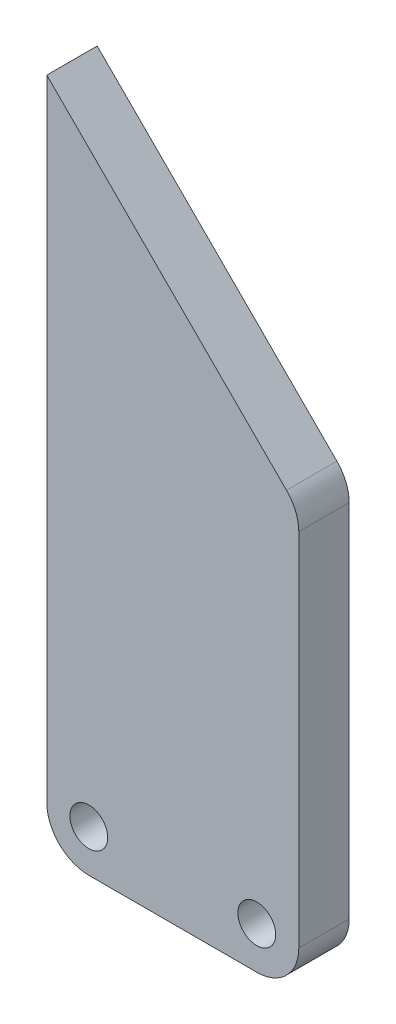
ISO-10303-21;
HEADER;
FILE_DESCRIPTION(('STEP AP214'),'2;1');
FILE_NAME('part.step','',(''),(''),'','','');
FILE_SCHEMA(('AUTOMOTIVE_DESIGN { 1 0 10303 214 1 1 1 1 }'));
ENDSEC;
DATA;
#1=APPLICATION_CONTEXT('core data for automotive mechanical design processes');
#2=APPLICATION_PROTOCOL_DEFINITION('international standard','automotive_design',2000,#1);
#3=PRODUCT_CONTEXT('',#1,'mechanical');
#4=PRODUCT('Part','Part','',(#3));
#5=PRODUCT_RELATED_PRODUCT_CATEGORY('part','',(#4));
#6=PRODUCT_DEFINITION_FORMATION('','',#4);
#7=PRODUCT_DEFINITION_CONTEXT('part definition',#1,'design');
#8=PRODUCT_DEFINITION('design','',#6,#7);
#9=PRODUCT_DEFINITION_SHAPE('','',#8);
#10=(LENGTH_UNIT() NAMED_UNIT(*) SI_UNIT(.MILLI.,.METRE.));
#11=(NAMED_UNIT(*) PLANE_ANGLE_UNIT() SI_UNIT($,.RADIAN.));
#12=(NAMED_UNIT(*) SI_UNIT($,.STERADIAN.) SOLID_ANGLE_UNIT());
#13=UNCERTAINTY_MEASURE_WITH_UNIT(LENGTH_MEASURE(1.E-05),#10,'distance_accuracy_value','');
#14=(GEOMETRIC_REPRESENTATION_CONTEXT(3) GLOBAL_UNCERTAINTY_ASSIGNED_CONTEXT((#13)) GLOBAL_UNIT_ASSIGNED_CONTEXT((#10,
#11,#12)) REPRESENTATION_CONTEXT('',''));
#15=CARTESIAN_POINT('',(0.,0.,0.));
#16=DIRECTION('',(0.,0.,1.));
#17=DIRECTION('',(1.,0.,0.));
#18=AXIS2_PLACEMENT_3D('',#15,#16,#17);
#19=CARTESIAN_POINT('',(30.,0.,3.));
#20=DIRECTION('',(0.,1.,0.));
#21=DIRECTION('',(-1.,0.,0.));
#22=AXIS2_PLACEMENT_3D('',#19,#20,#21);
#23=PLANE('',#22);
#24=DIRECTION('',(1.,0.,0.));
#25=VECTOR('',#24,1.);
#26=CARTESIAN_POINT('',(30.,0.,3.));
#27=LINE('',#26,#25);
#28=CARTESIAN_POINT('',(5.,0.,3.));
#29=VERTEX_POINT('',#28);
#30=CARTESIAN_POINT('',(25.,0.,3.));
#31=VERTEX_POINT('',#30);
#32=EDGE_CURVE('E125',#29,#31,#27,.T.);
#33=ORIENTED_EDGE('',*,*,#32,.F.);
#34=DIRECTION('',(0.,0.,-1.));
#35=VECTOR('',#34,1.);
#36=CARTESIAN_POINT('',(5.,0.,3.));
#37=LINE('',#36,#35);
#38=CARTESIAN_POINT('',(5.,0.,-3.));
#39=VERTEX_POINT('',#38);
#40=EDGE_CURVE('E40',#29,#39,#37,.T.);
#41=ORIENTED_EDGE('',*,*,#40,.T.);
#42=DIRECTION('',(1.,0.,0.));
#43=VECTOR('',#42,1.);
#44=CARTESIAN_POINT('',(30.,0.,-3.));
#45=LINE('',#44,#43);
#46=CARTESIAN_POINT('',(25.,0.,-3.));
#47=VERTEX_POINT('',#46);
#48=EDGE_CURVE('E117',#39,#47,#45,.T.);
#49=ORIENTED_EDGE('',*,*,#48,.T.);
#50=DIRECTION('',(0.,0.,-1.));
#51=VECTOR('',#50,1.);
#52=CARTESIAN_POINT('',(25.,0.,3.));
#53=LINE('',#52,#51);
#54=EDGE_CURVE('E53',#47,#31,#53,.F.);
#55=ORIENTED_EDGE('',*,*,#54,.T.);
#56=EDGE_LOOP('',(#33,#41,#49,#55));
#57=FACE_BOUND('',#56,.T.);
#58=ADVANCED_FACE('F32',(#57),#23,.F.);
#59=CARTESIAN_POINT('',(29.9999999999998,49.9999999999999,3.));
#60=DIRECTION('',(-1.,0.,0.));
#61=DIRECTION('',(0.,-1.,0.));
#62=AXIS2_PLACEMENT_3D('',#59,#60,#61);
#63=PLANE('',#62);
#64=DIRECTION('',(0.,1.,0.));
#65=VECTOR('',#64,1.);
#66=CARTESIAN_POINT('',(29.9999999999998,49.9999999999999,-3.));
#67=LINE('',#66,#65);
#68=CARTESIAN_POINT('',(30.,5.00000000000002,-3.));
#69=VERTEX_POINT('',#68);
#70=CARTESIAN_POINT('',(29.9999999999998,47.9289321881344,-3.));
#71=VERTEX_POINT('',#70);
#72=EDGE_CURVE('E119',#69,#71,#67,.T.);
#73=ORIENTED_EDGE('',*,*,#72,.T.);
#74=DIRECTION('',(0.,0.,-1.));
#75=VECTOR('',#74,1.);
#76=CARTESIAN_POINT('',(29.9999999999998,47.9289321881344,3.));
#77=LINE('',#76,#75);
#78=CARTESIAN_POINT('',(29.9999999999998,47.9289321881344,3.));
#79=VERTEX_POINT('',#78);
#80=EDGE_CURVE('E137',#71,#79,#77,.F.);
#81=ORIENTED_EDGE('',*,*,#80,.T.);
#82=DIRECTION('',(0.,1.,0.));
#83=VECTOR('',#82,1.);
#84=CARTESIAN_POINT('',(29.9999999999998,49.9999999999999,3.));
#85=LINE('',#84,#83);
#86=CARTESIAN_POINT('',(30.,5.00000000000002,3.));
#87=VERTEX_POINT('',#86);
#88=EDGE_CURVE('E103',#87,#79,#85,.T.);
#89=ORIENTED_EDGE('',*,*,#88,.F.);
#90=DIRECTION('',(0.,0.,-1.));
#91=VECTOR('',#90,1.);
#92=CARTESIAN_POINT('',(30.,5.00000000000002,3.));
#93=LINE('',#92,#91);
#94=EDGE_CURVE('E134',#87,#69,#93,.T.);
#95=ORIENTED_EDGE('',*,*,#94,.T.);
#96=EDGE_LOOP('',(#73,#81,#89,#95));
#97=FACE_BOUND('',#96,.T.);
#98=ADVANCED_FACE('F156',(#97),#63,.F.);
#99=CARTESIAN_POINT('',(0.,80.,3.));
#100=DIRECTION('',(-0.707106781186551,-0.707106781186544,0.));
#101=DIRECTION('',(0.707106781186544,-0.707106781186551,0.));
#102=AXIS2_PLACEMENT_3D('',#99,#100,#101);
#103=PLANE('',#102);
#104=DIRECTION('',(-0.707106781186544,0.707106781186551,0.));
#105=VECTOR('',#104,1.);
#106=CARTESIAN_POINT('',(0.,80.,3.));
#107=LINE('',#106,#105);
#108=CARTESIAN_POINT('',(28.5355339059326,51.4644660940671,3.));
#109=VERTEX_POINT('',#108);
#110=CARTESIAN_POINT('',(0.,80.,3.));
#111=VERTEX_POINT('',#110);
#112=EDGE_CURVE('E92',#109,#111,#107,.T.);
#113=ORIENTED_EDGE('',*,*,#112,.F.);
#114=DIRECTION('',(0.,0.,-1.));
#115=VECTOR('',#114,1.);
#116=CARTESIAN_POINT('',(28.5355339059326,51.4644660940671,3.));
#117=LINE('',#116,#115);
#118=CARTESIAN_POINT('',(28.5355339059326,51.4644660940671,-3.));
#119=VERTEX_POINT('',#118);
#120=EDGE_CURVE('E111',#109,#119,#117,.T.);
#121=ORIENTED_EDGE('',*,*,#120,.T.);
#122=DIRECTION('',(-0.707106781186544,0.707106781186551,0.));
#123=VECTOR('',#122,1.);
#124=CARTESIAN_POINT('',(0.,80.,-3.));
#125=LINE('',#124,#123);
#126=CARTESIAN_POINT('',(0.,80.,-3.));
#127=VERTEX_POINT('',#126);
#128=EDGE_CURVE('E109',#119,#127,#125,.T.);
#129=ORIENTED_EDGE('',*,*,#128,.T.);
#130=DIRECTION('',(0.,0.,-1.));
#131=VECTOR('',#130,1.);
#132=CARTESIAN_POINT('',(0.,80.,3.));
#133=LINE('',#132,#131);
#134=EDGE_CURVE('E106',#111,#127,#133,.T.);
#135=ORIENTED_EDGE('',*,*,#134,.F.);
#136=EDGE_LOOP('',(#113,#121,#129,#135));
#137=FACE_BOUND('',#136,.T.);
#138=ADVANCED_FACE('F107',(#137),#103,.F.);
#139=CARTESIAN_POINT('',(0.,0.,3.));
#140=DIRECTION('',(1.,0.,0.));
#141=DIRECTION('',(0.,0.,-1.));
#142=AXIS2_PLACEMENT_3D('',#139,#140,#141);
#143=PLANE('',#142);
#144=DIRECTION('',(0.,-1.,0.));
#145=VECTOR('',#144,1.);
#146=CARTESIAN_POINT('',(0.,0.,-3.));
#147=LINE('',#146,#145);
#148=CARTESIAN_POINT('',(0.,5.,-3.));
#149=VERTEX_POINT('',#148);
#150=EDGE_CURVE('E124',#127,#149,#147,.T.);
#151=ORIENTED_EDGE('',*,*,#150,.T.);
#152=DIRECTION('',(0.,0.,-1.));
#153=VECTOR('',#152,1.);
#154=CARTESIAN_POINT('',(0.,5.,3.));
#155=LINE('',#154,#153);
#156=CARTESIAN_POINT('',(0.,5.,3.));
#157=VERTEX_POINT('',#156);
#158=EDGE_CURVE('E11',#149,#157,#155,.F.);
#159=ORIENTED_EDGE('',*,*,#158,.T.);
#160=DIRECTION('',(0.,-1.,0.));
#161=VECTOR('',#160,1.);
#162=CARTESIAN_POINT('',(0.,0.,3.));
#163=LINE('',#162,#161);
#164=EDGE_CURVE('E96',#111,#157,#163,.T.);
#165=ORIENTED_EDGE('',*,*,#164,.F.);
#166=ORIENTED_EDGE('',*,*,#134,.T.);
#167=EDGE_LOOP('',(#151,#159,#165,#166));
#168=FACE_BOUND('',#167,.T.);
#169=ADVANCED_FACE('F113',(#168),#143,.F.);
#170=CARTESIAN_POINT('',(0.,0.,3.));
#171=DIRECTION('',(0.,0.,-1.));
#172=DIRECTION('',(-1.,0.,0.));
#173=AXIS2_PLACEMENT_3D('',#170,#171,#172);
#174=PLANE('',#173);
#175=CARTESIAN_POINT('',(5.,5.,3.));
#176=DIRECTION('',(0.,0.,1.));
#177=DIRECTION('',(1.,0.,0.));
#178=AXIS2_PLACEMENT_3D('',#175,#176,#177);
#179=CIRCLE('',#178,2.24999999999999);
#180=CARTESIAN_POINT('',(7.24999999999999,5.,3.));
#181=VERTEX_POINT('',#180);
#182=EDGE_CURVE('E168',#181,#181,#179,.T.);
#183=ORIENTED_EDGE('',*,*,#182,.F.);
#184=EDGE_LOOP('',(#183));
#185=FACE_BOUND('',#184,.T.);
#186=CARTESIAN_POINT('',(25.,5.,3.));
#187=DIRECTION('',(0.,0.,1.));
#188=DIRECTION('',(1.,0.,0.));
#189=AXIS2_PLACEMENT_3D('',#186,#187,#188);
#190=CIRCLE('',#189,2.24999999999999);
#191=CARTESIAN_POINT('',(27.25,5.,3.));
#192=VERTEX_POINT('',#191);
#193=EDGE_CURVE('E162',#192,#192,#190,.T.);
#194=ORIENTED_EDGE('',*,*,#193,.F.);
#195=EDGE_LOOP('',(#194));
#196=FACE_BOUND('',#195,.T.);
#197=ORIENTED_EDGE('',*,*,#88,.T.);
#198=CARTESIAN_POINT('',(24.9999999999998,47.9289321881344,3.));
#199=DIRECTION('',(0.,0.,-1.));
#200=DIRECTION('',(-1.,0.,0.));
#201=AXIS2_PLACEMENT_3D('',#198,#199,#200);
#202=CIRCLE('',#201,5.);
#203=EDGE_CURVE('E99',#79,#109,#202,.F.);
#204=ORIENTED_EDGE('',*,*,#203,.T.);
#205=ORIENTED_EDGE('',*,*,#112,.T.);
#206=ORIENTED_EDGE('',*,*,#164,.T.);
#207=CARTESIAN_POINT('',(5.,5.,3.));
#208=DIRECTION('',(0.,0.,-1.));
#209=DIRECTION('',(-1.,0.,0.));
#210=AXIS2_PLACEMENT_3D('',#207,#208,#209);
#211=CIRCLE('',#210,5.);
#212=EDGE_CURVE('E141',#157,#29,#211,.F.);
#213=ORIENTED_EDGE('',*,*,#212,.T.);
#214=ORIENTED_EDGE('',*,*,#32,.T.);
#215=CARTESIAN_POINT('',(25.,5.,3.));
#216=DIRECTION('',(0.,0.,-1.));
#217=DIRECTION('',(-1.,0.,0.));
#218=AXIS2_PLACEMENT_3D('',#215,#216,#217);
#219=CIRCLE('',#218,5.);
#220=EDGE_CURVE('E139',#31,#87,#219,.F.);
#221=ORIENTED_EDGE('',*,*,#220,.T.);
#222=EDGE_LOOP('',(#197,#204,#205,#206,#213,#214,#221));
#223=FACE_BOUND('',#222,.T.);
#224=ADVANCED_FACE('F95',(#185,#196,#223),#174,.F.);
#225=CARTESIAN_POINT('',(0.,0.,-3.));
#226=DIRECTION('',(0.,0.,-1.));
#227=DIRECTION('',(-1.,0.,0.));
#228=AXIS2_PLACEMENT_3D('',#225,#226,#227);
#229=PLANE('',#228);
#230=CARTESIAN_POINT('',(5.,5.,-3.));
#231=DIRECTION('',(0.,0.,-1.));
#232=DIRECTION('',(-1.,0.,0.));
#233=AXIS2_PLACEMENT_3D('',#230,#231,#232);
#234=CIRCLE('',#233,2.24999999999999);
#235=CARTESIAN_POINT('',(2.75,5.,-3.));
#236=VERTEX_POINT('',#235);
#237=EDGE_CURVE('E165',#236,#236,#234,.T.);
#238=ORIENTED_EDGE('',*,*,#237,.F.);
#239=EDGE_LOOP('',(#238));
#240=FACE_BOUND('',#239,.T.);
#241=CARTESIAN_POINT('',(25.,5.,-3.));
#242=DIRECTION('',(0.,0.,-1.));
#243=DIRECTION('',(-1.,0.,0.));
#244=AXIS2_PLACEMENT_3D('',#241,#242,#243);
#245=CIRCLE('',#244,2.24999999999999);
#246=CARTESIAN_POINT('',(22.75,5.,-3.));
#247=VERTEX_POINT('',#246);
#248=EDGE_CURVE('E120',#247,#247,#245,.T.);
#249=ORIENTED_EDGE('',*,*,#248,.F.);
#250=EDGE_LOOP('',(#249));
#251=FACE_BOUND('',#250,.T.);
#252=ORIENTED_EDGE('',*,*,#128,.F.);
#253=CARTESIAN_POINT('',(24.9999999999998,47.9289321881344,-3.));
#254=DIRECTION('',(0.,0.,-1.));
#255=DIRECTION('',(-1.,0.,0.));
#256=AXIS2_PLACEMENT_3D('',#253,#254,#255);
#257=CIRCLE('',#256,5.);
#258=EDGE_CURVE('E132',#119,#71,#257,.T.);
#259=ORIENTED_EDGE('',*,*,#258,.T.);
#260=ORIENTED_EDGE('',*,*,#72,.F.);
#261=CARTESIAN_POINT('',(25.,5.,-3.));
#262=DIRECTION('',(0.,0.,-1.));
#263=DIRECTION('',(-1.,0.,0.));
#264=AXIS2_PLACEMENT_3D('',#261,#262,#263);
#265=CIRCLE('',#264,5.);
#266=EDGE_CURVE('E128',#69,#47,#265,.T.);
#267=ORIENTED_EDGE('',*,*,#266,.T.);
#268=ORIENTED_EDGE('',*,*,#48,.F.);
#269=CARTESIAN_POINT('',(5.,5.,-3.));
#270=DIRECTION('',(0.,0.,-1.));
#271=DIRECTION('',(-1.,0.,0.));
#272=AXIS2_PLACEMENT_3D('',#269,#270,#271);
#273=CIRCLE('',#272,5.);
#274=EDGE_CURVE('E130',#39,#149,#273,.T.);
#275=ORIENTED_EDGE('',*,*,#274,.T.);
#276=ORIENTED_EDGE('',*,*,#150,.F.);
#277=EDGE_LOOP('',(#252,#259,#260,#267,#268,#275,#276));
#278=FACE_BOUND('',#277,.T.);
#279=ADVANCED_FACE('F149',(#240,#251,#278),#229,.T.);
#280=CARTESIAN_POINT('',(25.,5.,3.));
#281=DIRECTION('',(0.,0.,1.));
#282=DIRECTION('',(1.,0.,0.));
#283=AXIS2_PLACEMENT_3D('',#280,#281,#282);
#284=CYLINDRICAL_SURFACE('',#283,2.24999999999999);
#285=ORIENTED_EDGE('',*,*,#193,.T.);
#286=EDGE_LOOP('',(#285));
#287=FACE_BOUND('',#286,.T.);
#288=ORIENTED_EDGE('',*,*,#248,.T.);
#289=EDGE_LOOP('',(#288));
#290=FACE_BOUND('',#289,.T.);
#291=ADVANCED_FACE('F180',(#287,#290),#284,.F.);
#292=CARTESIAN_POINT('',(5.,5.,3.));
#293=DIRECTION('',(0.,0.,1.));
#294=DIRECTION('',(1.,0.,0.));
#295=AXIS2_PLACEMENT_3D('',#292,#293,#294);
#296=CYLINDRICAL_SURFACE('',#295,2.24999999999999);
#297=ORIENTED_EDGE('',*,*,#182,.T.);
#298=EDGE_LOOP('',(#297));
#299=FACE_BOUND('',#298,.T.);
#300=ORIENTED_EDGE('',*,*,#237,.T.);
#301=EDGE_LOOP('',(#300));
#302=FACE_BOUND('',#301,.T.);
#303=ADVANCED_FACE('F172',(#299,#302),#296,.F.);
#304=CARTESIAN_POINT('',(24.9999999999998,47.9289321881344,3.));
#305=DIRECTION('',(0.,0.,-1.));
#306=DIRECTION('',(-1.,0.,0.));
#307=AXIS2_PLACEMENT_3D('',#304,#305,#306);
#308=CYLINDRICAL_SURFACE('',#307,5.);
#309=ORIENTED_EDGE('',*,*,#203,.F.);
#310=ORIENTED_EDGE('',*,*,#80,.F.);
#311=ORIENTED_EDGE('',*,*,#258,.F.);
#312=ORIENTED_EDGE('',*,*,#120,.F.);
#313=EDGE_LOOP('',(#309,#310,#311,#312));
#314=FACE_BOUND('',#313,.T.);
#315=ADVANCED_FACE('F201',(#314),#308,.T.);
#316=CARTESIAN_POINT('',(5.,5.,3.));
#317=DIRECTION('',(0.,0.,-1.));
#318=DIRECTION('',(-1.,0.,0.));
#319=AXIS2_PLACEMENT_3D('',#316,#317,#318);
#320=CYLINDRICAL_SURFACE('',#319,5.);
#321=ORIENTED_EDGE('',*,*,#212,.F.);
#322=ORIENTED_EDGE('',*,*,#158,.F.);
#323=ORIENTED_EDGE('',*,*,#274,.F.);
#324=ORIENTED_EDGE('',*,*,#40,.F.);
#325=EDGE_LOOP('',(#321,#322,#323,#324));
#326=FACE_BOUND('',#325,.T.);
#327=ADVANCED_FACE('F203',(#326),#320,.T.);
#328=CARTESIAN_POINT('',(25.,5.,3.));
#329=DIRECTION('',(0.,0.,-1.));
#330=DIRECTION('',(-1.,0.,0.));
#331=AXIS2_PLACEMENT_3D('',#328,#329,#330);
#332=CYLINDRICAL_SURFACE('',#331,5.);
#333=ORIENTED_EDGE('',*,*,#220,.F.);
#334=ORIENTED_EDGE('',*,*,#54,.F.);
#335=ORIENTED_EDGE('',*,*,#266,.F.);
#336=ORIENTED_EDGE('',*,*,#94,.F.);
#337=EDGE_LOOP('',(#333,#334,#335,#336));
#338=FACE_BOUND('',#337,.T.);
#339=ADVANCED_FACE('F34',(#338),#332,.T.);
#340=CLOSED_SHELL('',(#58,#98,#138,#169,#224,#279,#291,#303,#315,#327,#339));
#341=MANIFOLD_SOLID_BREP('B2',#340);
#342=ADVANCED_BREP_SHAPE_REPRESENTATION('',(#18,#341),#14);
#343=SHAPE_DEFINITION_REPRESENTATION(#9,#342);
ENDSEC;
END-ISO-10303-21;
